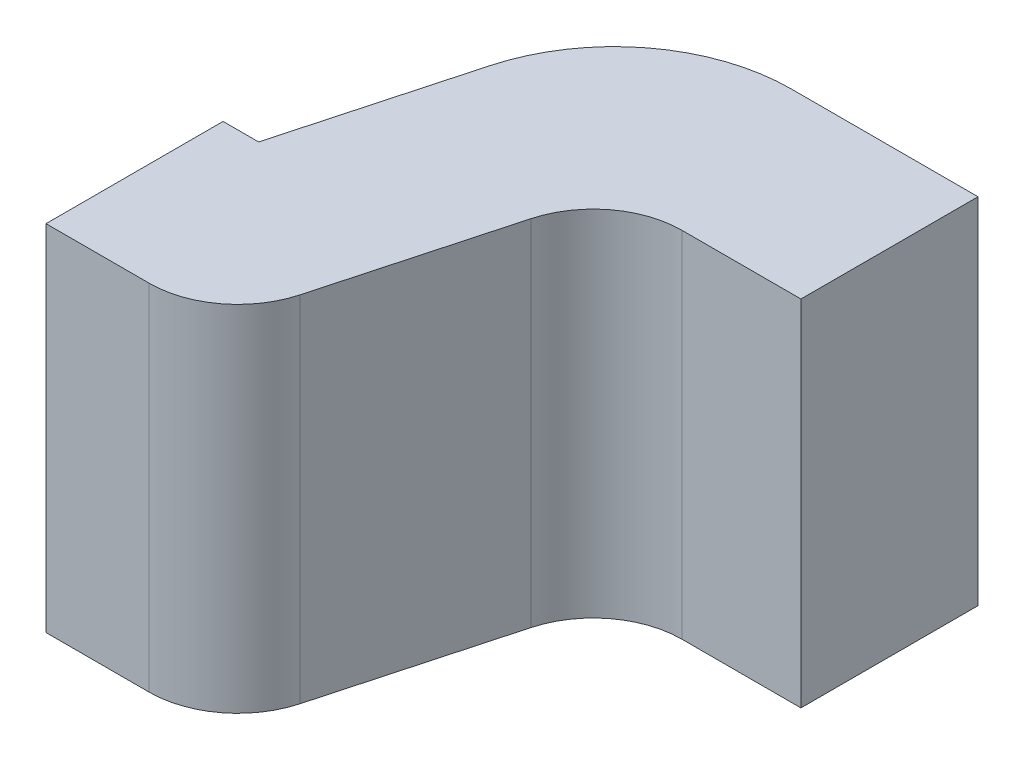
ISO-10303-21;
HEADER;
FILE_DESCRIPTION(('STEP AP214'),'2;1');
FILE_NAME('part.step','',(''),(''),'','','');
FILE_SCHEMA(('AUTOMOTIVE_DESIGN { 1 0 10303 214 1 1 1 1 }'));
ENDSEC;
DATA;
#1=APPLICATION_CONTEXT('core data for automotive mechanical design processes');
#2=APPLICATION_PROTOCOL_DEFINITION('international standard','automotive_design',2000,#1);
#3=PRODUCT_CONTEXT('',#1,'mechanical');
#4=PRODUCT('Part','Part','',(#3));
#5=PRODUCT_RELATED_PRODUCT_CATEGORY('part','',(#4));
#6=PRODUCT_DEFINITION_FORMATION('','',#4);
#7=PRODUCT_DEFINITION_CONTEXT('part definition',#1,'design');
#8=PRODUCT_DEFINITION('design','',#6,#7);
#9=PRODUCT_DEFINITION_SHAPE('','',#8);
#10=(LENGTH_UNIT() NAMED_UNIT(*) SI_UNIT(.MILLI.,.METRE.));
#11=(NAMED_UNIT(*) PLANE_ANGLE_UNIT() SI_UNIT($,.RADIAN.));
#12=(NAMED_UNIT(*) SI_UNIT($,.STERADIAN.) SOLID_ANGLE_UNIT());
#13=UNCERTAINTY_MEASURE_WITH_UNIT(LENGTH_MEASURE(1.E-05),#10,'distance_accuracy_value','');
#14=(GEOMETRIC_REPRESENTATION_CONTEXT(3) GLOBAL_UNCERTAINTY_ASSIGNED_CONTEXT((#13)) GLOBAL_UNIT_ASSIGNED_CONTEXT((#10,
#11,#12)) REPRESENTATION_CONTEXT('',''));
#15=CARTESIAN_POINT('',(0.,0.,0.));
#16=DIRECTION('',(0.,0.,1.));
#17=DIRECTION('',(1.,0.,0.));
#18=AXIS2_PLACEMENT_3D('',#15,#16,#17);
#19=CARTESIAN_POINT('',(0.898916234097,0.22,0.269792734049));
#20=DIRECTION('',(0.,1.,0.));
#21=DIRECTION('',(-1.,0.,0.));
#22=AXIS2_PLACEMENT_3D('',#19,#20,#21);
#23=PLANE('',#22);
#24=DIRECTION('',(1.,0.,0.));
#25=VECTOR('',#24,1.);
#26=CARTESIAN_POINT('',(0.8,0.22,0.22));
#27=LINE('',#26,#25);
#28=CARTESIAN_POINT('',(1.2,0.22,0.22));
#29=VERTEX_POINT('',#28);
#30=CARTESIAN_POINT('',(1.05205262753,0.22,0.22));
#31=VERTEX_POINT('',#30);
#32=EDGE_CURVE('E86',#29,#31,#27,.F.);
#33=ORIENTED_EDGE('',*,*,#32,.F.);
#34=DIRECTION('',(0.,0.,-1.));
#35=VECTOR('',#34,1.);
#36=CARTESIAN_POINT('',(1.2,0.22,0.));
#37=LINE('',#36,#35);
#38=CARTESIAN_POINT('',(1.2,0.22,0.));
#39=VERTEX_POINT('',#38);
#40=EDGE_CURVE('E105',#39,#29,#37,.F.);
#41=ORIENTED_EDGE('',*,*,#40,.F.);
#42=DIRECTION('',(1.,0.,0.));
#43=VECTOR('',#42,1.);
#44=CARTESIAN_POINT('',(0.8,0.22,0.));
#45=LINE('',#44,#43);
#46=CARTESIAN_POINT('',(0.96803508502,0.22,0.));
#47=VERTEX_POINT('',#46);
#48=EDGE_CURVE('E129',#39,#47,#45,.F.);
#49=ORIENTED_EDGE('',*,*,#48,.T.);
#50=CARTESIAN_POINT('',(0.96803508502,0.22,0.22));
#51=DIRECTION('',(0.,1.,0.));
#52=DIRECTION('',(0.,0.,1.));
#53=AXIS2_PLACEMENT_3D('',#50,#51,#52);
#54=CIRCLE('',#53,0.22);
#55=CARTESIAN_POINT('',(0.755787044347605,0.22,0.162114170725821));
#56=VERTEX_POINT('',#55);
#57=EDGE_CURVE('E176',#56,#47,#54,.F.);
#58=ORIENTED_EDGE('',*,*,#57,.F.);
#59=DIRECTION('',(0.26311740579194,0.,-0.964763821237778));
#60=VECTOR('',#59,1.);
#61=CARTESIAN_POINT('',(0.8,0.22,0.));
#62=LINE('',#61,#60);
#63=CARTESIAN_POINT('',(0.694212955652576,0.22,0.387885829274105));
#64=VERTEX_POINT('',#63);
#65=EDGE_CURVE('E135',#56,#64,#62,.F.);
#66=ORIENTED_EDGE('',*,*,#65,.T.);
#67=DIRECTION('',(1.,0.,0.));
#68=VECTOR('',#67,1.);
#69=CARTESIAN_POINT('',(0.65,0.22,0.387885829274));
#70=LINE('',#69,#68);
#71=CARTESIAN_POINT('',(0.65,0.22,0.387885829274));
#72=VERTEX_POINT('',#71);
#73=EDGE_CURVE('E142',#64,#72,#70,.F.);
#74=ORIENTED_EDGE('',*,*,#73,.T.);
#75=DIRECTION('',(0.,0.,-1.));
#76=VECTOR('',#75,1.);
#77=CARTESIAN_POINT('',(0.65,0.22,0.387885829274));
#78=LINE('',#77,#76);
#79=CARTESIAN_POINT('',(0.65,0.22,0.607885829274));
#80=VERTEX_POINT('',#79);
#81=EDGE_CURVE('E148',#72,#80,#78,.F.);
#82=ORIENTED_EDGE('',*,*,#81,.T.);
#83=DIRECTION('',(1.,0.,0.));
#84=VECTOR('',#83,1.);
#85=CARTESIAN_POINT('',(0.65,0.22,0.607885829274));
#86=LINE('',#85,#84);
#87=CARTESIAN_POINT('',(0.778230498162,0.22,0.607885829274));
#88=VERTEX_POINT('',#87);
#89=EDGE_CURVE('E154',#88,#80,#86,.F.);
#90=ORIENTED_EDGE('',*,*,#89,.F.);
#91=CARTESIAN_POINT('',(0.778230498162,0.22,0.497885829274));
#92=DIRECTION('',(0.,1.,0.));
#93=DIRECTION('',(0.,0.,1.));
#94=AXIS2_PLACEMENT_3D('',#91,#92,#93);
#95=CIRCLE('',#94,0.11);
#96=CARTESIAN_POINT('',(0.884354518498314,0.22,0.526828743910985));
#97=VERTEX_POINT('',#96);
#98=EDGE_CURVE('E157',#97,#88,#95,.F.);
#99=ORIENTED_EDGE('',*,*,#98,.F.);
#100=DIRECTION('',(0.26311740579194,0.,-0.964763821237778));
#101=VECTOR('',#100,1.);
#102=CARTESIAN_POINT('',(1.012248040672,0.22,0.05788582927426));
#103=LINE('',#102,#101);
#104=CARTESIAN_POINT('',(0.945928607193356,0.22,0.301057085362789));
#105=VERTEX_POINT('',#104);
#106=EDGE_CURVE('E160',#105,#97,#103,.F.);
#107=ORIENTED_EDGE('',*,*,#106,.F.);
#108=CARTESIAN_POINT('',(1.05205262753,0.22,0.33));
#109=DIRECTION('',(0.,1.,0.));
#110=DIRECTION('',(0.,0.,1.));
#111=AXIS2_PLACEMENT_3D('',#108,#109,#110);
#112=CIRCLE('',#111,0.11);
#113=EDGE_CURVE('E20',#105,#31,#112,.F.);
#114=ORIENTED_EDGE('',*,*,#113,.T.);
#115=EDGE_LOOP('',(#33,#41,#49,#58,#66,#74,#82,#90,#99,#107,#114));
#116=FACE_BOUND('',#115,.T.);
#117=ADVANCED_FACE('F17',(#116),#23,.T.);
#118=CARTESIAN_POINT('',(0.8,-0.22,0.));
#119=DIRECTION('',(0.,0.,1.));
#120=DIRECTION('',(1.,0.,0.));
#121=AXIS2_PLACEMENT_3D('',#118,#119,#120);
#122=PLANE('',#121);
#123=ORIENTED_EDGE('',*,*,#48,.F.);
#124=DIRECTION('',(0.,1.,0.));
#125=VECTOR('',#124,1.);
#126=CARTESIAN_POINT('',(1.2,-0.22,0.));
#127=LINE('',#126,#125);
#128=CARTESIAN_POINT('',(1.2,-0.22,0.));
#129=VERTEX_POINT('',#128);
#130=EDGE_CURVE('E94',#129,#39,#127,.T.);
#131=ORIENTED_EDGE('',*,*,#130,.F.);
#132=DIRECTION('',(1.,0.,0.));
#133=VECTOR('',#132,1.);
#134=CARTESIAN_POINT('',(0.898916234097,-0.22,0.));
#135=LINE('',#134,#133);
#136=CARTESIAN_POINT('',(0.96803508502,-0.22,0.));
#137=VERTEX_POINT('',#136);
#138=EDGE_CURVE('E119',#137,#129,#135,.T.);
#139=ORIENTED_EDGE('',*,*,#138,.F.);
#140=DIRECTION('',(0.,1.,0.));
#141=VECTOR('',#140,1.);
#142=CARTESIAN_POINT('',(0.96803508502,-0.22,0.));
#143=LINE('',#142,#141);
#144=EDGE_CURVE('E121',#47,#137,#143,.F.);
#145=ORIENTED_EDGE('',*,*,#144,.F.);
#146=EDGE_LOOP('',(#123,#131,#139,#145));
#147=FACE_BOUND('',#146,.T.);
#148=ADVANCED_FACE('F254',(#147),#122,.F.);
#149=CARTESIAN_POINT('',(1.2,-0.22,0.));
#150=DIRECTION('',(1.,0.,0.));
#151=DIRECTION('',(0.,0.,-1.));
#152=AXIS2_PLACEMENT_3D('',#149,#150,#151);
#153=PLANE('',#152);
#154=ORIENTED_EDGE('',*,*,#40,.T.);
#155=DIRECTION('',(0.,1.,0.));
#156=VECTOR('',#155,1.);
#157=CARTESIAN_POINT('',(1.2,-0.22,0.22));
#158=LINE('',#157,#156);
#159=CARTESIAN_POINT('',(1.2,-0.22,0.22));
#160=VERTEX_POINT('',#159);
#161=EDGE_CURVE('E99',#160,#29,#158,.T.);
#162=ORIENTED_EDGE('',*,*,#161,.F.);
#163=DIRECTION('',(0.,0.,1.));
#164=VECTOR('',#163,1.);
#165=CARTESIAN_POINT('',(1.2,-0.22,0.269792734049));
#166=LINE('',#165,#164);
#167=EDGE_CURVE('E103',#129,#160,#166,.T.);
#168=ORIENTED_EDGE('',*,*,#167,.F.);
#169=ORIENTED_EDGE('',*,*,#130,.T.);
#170=EDGE_LOOP('',(#154,#162,#168,#169));
#171=FACE_BOUND('',#170,.T.);
#172=ADVANCED_FACE('F101',(#171),#153,.T.);
#173=CARTESIAN_POINT('',(0.8,-0.22,0.22));
#174=DIRECTION('',(0.,0.,1.));
#175=DIRECTION('',(1.,0.,0.));
#176=AXIS2_PLACEMENT_3D('',#173,#174,#175);
#177=PLANE('',#176);
#178=DIRECTION('',(1.,0.,0.));
#179=VECTOR('',#178,1.);
#180=CARTESIAN_POINT('',(0.898916234097,-0.22,0.22));
#181=LINE('',#180,#179);
#182=CARTESIAN_POINT('',(1.05205262753,-0.22,0.22));
#183=VERTEX_POINT('',#182);
#184=EDGE_CURVE('E109',#160,#183,#181,.F.);
#185=ORIENTED_EDGE('',*,*,#184,.F.);
#186=ORIENTED_EDGE('',*,*,#161,.T.);
#187=ORIENTED_EDGE('',*,*,#32,.T.);
#188=DIRECTION('',(0.,1.,0.));
#189=VECTOR('',#188,1.);
#190=CARTESIAN_POINT('',(1.05205262753,-0.22,0.22));
#191=LINE('',#190,#189);
#192=EDGE_CURVE('E111',#31,#183,#191,.F.);
#193=ORIENTED_EDGE('',*,*,#192,.T.);
#194=EDGE_LOOP('',(#185,#186,#187,#193));
#195=FACE_BOUND('',#194,.T.);
#196=ADVANCED_FACE('F110',(#195),#177,.T.);
#197=CARTESIAN_POINT('',(1.05205262753,-0.22,0.33));
#198=DIRECTION('',(0.,1.,0.));
#199=DIRECTION('',(0.,0.,1.));
#200=AXIS2_PLACEMENT_3D('',#197,#198,#199);
#201=CYLINDRICAL_SURFACE('',#200,0.11);
#202=ORIENTED_EDGE('',*,*,#113,.F.);
#203=DIRECTION('',(0.,1.,0.));
#204=VECTOR('',#203,1.);
#205=CARTESIAN_POINT('',(0.945928607193347,-0.22,0.301057085362822));
#206=LINE('',#205,#204);
#207=CARTESIAN_POINT('',(0.945928607193691,-0.22,0.301057085362849));
#208=VERTEX_POINT('',#207);
#209=EDGE_CURVE('E163',#208,#105,#206,.T.);
#210=ORIENTED_EDGE('',*,*,#209,.F.);
#211=CARTESIAN_POINT('',(1.05205262753,-0.22,0.33));
#212=DIRECTION('',(0.,1.,0.));
#213=DIRECTION('',(0.,0.,1.));
#214=AXIS2_PLACEMENT_3D('',#211,#212,#213);
#215=CIRCLE('',#214,0.11);
#216=EDGE_CURVE('E115',#183,#208,#215,.T.);
#217=ORIENTED_EDGE('',*,*,#216,.F.);
#218=ORIENTED_EDGE('',*,*,#192,.F.);
#219=EDGE_LOOP('',(#202,#210,#217,#218));
#220=FACE_BOUND('',#219,.T.);
#221=ADVANCED_FACE('F194',(#220),#201,.F.);
#222=CARTESIAN_POINT('',(1.012248040672,-0.22,0.05788582927426));
#223=DIRECTION('',(0.964763821237778,0.,0.26311740579194));
#224=DIRECTION('',(0.26311740579194,0.,-0.964763821237778));
#225=AXIS2_PLACEMENT_3D('',#222,#223,#224);
#226=PLANE('',#225);
#227=ORIENTED_EDGE('',*,*,#106,.T.);
#228=DIRECTION('',(0.,1.,0.));
#229=VECTOR('',#228,1.);
#230=CARTESIAN_POINT('',(0.884354518498243,-0.22,0.526828743910793));
#231=LINE('',#230,#229);
#232=CARTESIAN_POINT('',(0.88435451849857,-0.22,0.526828743911086));
#233=VERTEX_POINT('',#232);
#234=EDGE_CURVE('E162',#233,#97,#231,.T.);
#235=ORIENTED_EDGE('',*,*,#234,.F.);
#236=DIRECTION('',(-0.26311740579247,0.,0.964763821237634));
#237=VECTOR('',#236,1.);
#238=CARTESIAN_POINT('',(0.945928607194,-0.22,0.301057085363));
#239=LINE('',#238,#237);
#240=EDGE_CURVE('E174',#208,#233,#239,.T.);
#241=ORIENTED_EDGE('',*,*,#240,.F.);
#242=ORIENTED_EDGE('',*,*,#209,.T.);
#243=EDGE_LOOP('',(#227,#235,#241,#242));
#244=FACE_BOUND('',#243,.T.);
#245=ADVANCED_FACE('F192',(#244),#226,.T.);
#246=CARTESIAN_POINT('',(0.778230498162,-0.22,0.497885829274));
#247=DIRECTION('',(0.,1.,0.));
#248=DIRECTION('',(0.,0.,1.));
#249=AXIS2_PLACEMENT_3D('',#246,#247,#248);
#250=CYLINDRICAL_SURFACE('',#249,0.11);
#251=DIRECTION('',(0.,1.,0.));
#252=VECTOR('',#251,1.);
#253=CARTESIAN_POINT('',(0.778230498162,-0.22,0.607885829274));
#254=LINE('',#253,#252);
#255=CARTESIAN_POINT('',(0.778230498162,-0.22,0.607885829274));
#256=VERTEX_POINT('',#255);
#257=EDGE_CURVE('E151',#256,#88,#254,.T.);
#258=ORIENTED_EDGE('',*,*,#257,.F.);
#259=CARTESIAN_POINT('',(0.778230498162,-0.22,0.497885829274));
#260=DIRECTION('',(0.,1.,0.));
#261=DIRECTION('',(0.,0.,1.));
#262=AXIS2_PLACEMENT_3D('',#259,#260,#261);
#263=CIRCLE('',#262,0.11);
#264=EDGE_CURVE('E170',#233,#256,#263,.F.);
#265=ORIENTED_EDGE('',*,*,#264,.F.);
#266=ORIENTED_EDGE('',*,*,#234,.T.);
#267=ORIENTED_EDGE('',*,*,#98,.T.);
#268=EDGE_LOOP('',(#258,#265,#266,#267));
#269=FACE_BOUND('',#268,.T.);
#270=ADVANCED_FACE('F277',(#269),#250,.T.);
#271=CARTESIAN_POINT('',(0.65,-0.22,0.607885829274));
#272=DIRECTION('',(0.,0.,1.));
#273=DIRECTION('',(1.,0.,0.));
#274=AXIS2_PLACEMENT_3D('',#271,#272,#273);
#275=PLANE('',#274);
#276=DIRECTION('',(1.,0.,0.));
#277=VECTOR('',#276,1.);
#278=CARTESIAN_POINT('',(0.898916234097,-0.22,0.607885829274));
#279=LINE('',#278,#277);
#280=CARTESIAN_POINT('',(0.65,-0.22,0.607885829274));
#281=VERTEX_POINT('',#280);
#282=EDGE_CURVE('E173',#256,#281,#279,.F.);
#283=ORIENTED_EDGE('',*,*,#282,.F.);
#284=ORIENTED_EDGE('',*,*,#257,.T.);
#285=ORIENTED_EDGE('',*,*,#89,.T.);
#286=DIRECTION('',(0.,1.,0.));
#287=VECTOR('',#286,1.);
#288=CARTESIAN_POINT('',(0.65,-0.22,0.607885829274));
#289=LINE('',#288,#287);
#290=EDGE_CURVE('E145',#80,#281,#289,.F.);
#291=ORIENTED_EDGE('',*,*,#290,.T.);
#292=EDGE_LOOP('',(#283,#284,#285,#291));
#293=FACE_BOUND('',#292,.T.);
#294=ADVANCED_FACE('F231',(#293),#275,.T.);
#295=CARTESIAN_POINT('',(0.65,-0.22,0.387885829274));
#296=DIRECTION('',(1.,0.,0.));
#297=DIRECTION('',(0.,0.,-1.));
#298=AXIS2_PLACEMENT_3D('',#295,#296,#297);
#299=PLANE('',#298);
#300=ORIENTED_EDGE('',*,*,#290,.F.);
#301=ORIENTED_EDGE('',*,*,#81,.F.);
#302=DIRECTION('',(0.,1.,0.));
#303=VECTOR('',#302,1.);
#304=CARTESIAN_POINT('',(0.65,-0.22,0.387885829274));
#305=LINE('',#304,#303);
#306=CARTESIAN_POINT('',(0.65,-0.22,0.387885829274));
#307=VERTEX_POINT('',#306);
#308=EDGE_CURVE('E139',#72,#307,#305,.F.);
#309=ORIENTED_EDGE('',*,*,#308,.T.);
#310=DIRECTION('',(0.,0.,1.));
#311=VECTOR('',#310,1.);
#312=CARTESIAN_POINT('',(0.65,-0.22,0.269792734049));
#313=LINE('',#312,#311);
#314=EDGE_CURVE('E214',#281,#307,#313,.F.);
#315=ORIENTED_EDGE('',*,*,#314,.F.);
#316=EDGE_LOOP('',(#300,#301,#309,#315));
#317=FACE_BOUND('',#316,.T.);
#318=ADVANCED_FACE('F235',(#317),#299,.F.);
#319=CARTESIAN_POINT('',(0.65,-0.22,0.387885829274));
#320=DIRECTION('',(0.,0.,1.));
#321=DIRECTION('',(1.,0.,0.));
#322=AXIS2_PLACEMENT_3D('',#319,#320,#321);
#323=PLANE('',#322);
#324=DIRECTION('',(1.,0.,0.));
#325=VECTOR('',#324,1.);
#326=CARTESIAN_POINT('',(0.898916234097,-0.22,0.387885829274));
#327=LINE('',#326,#325);
#328=CARTESIAN_POINT('',(0.694212955652192,-0.22,0.387885829274052));
#329=VERTEX_POINT('',#328);
#330=EDGE_CURVE('E211',#307,#329,#327,.T.);
#331=ORIENTED_EDGE('',*,*,#330,.F.);
#332=ORIENTED_EDGE('',*,*,#308,.F.);
#333=ORIENTED_EDGE('',*,*,#73,.F.);
#334=DIRECTION('',(0.,1.,0.));
#335=VECTOR('',#334,1.);
#336=CARTESIAN_POINT('',(0.694212955652576,-0.22,0.387885829274157));
#337=LINE('',#336,#335);
#338=EDGE_CURVE('E138',#64,#329,#337,.F.);
#339=ORIENTED_EDGE('',*,*,#338,.T.);
#340=EDGE_LOOP('',(#331,#332,#333,#339));
#341=FACE_BOUND('',#340,.T.);
#342=ADVANCED_FACE('F248',(#341),#323,.F.);
#343=CARTESIAN_POINT('',(0.8,-0.22,0.));
#344=DIRECTION('',(0.964763821237778,0.,0.26311740579194));
#345=DIRECTION('',(0.26311740579194,0.,-0.964763821237778));
#346=AXIS2_PLACEMENT_3D('',#343,#344,#345);
#347=PLANE('',#346);
#348=ORIENTED_EDGE('',*,*,#65,.F.);
#349=DIRECTION('',(0.,1.,0.));
#350=VECTOR('',#349,1.);
#351=CARTESIAN_POINT('',(0.755787044347653,-0.22,0.162114170725905));
#352=LINE('',#351,#350);
#353=CARTESIAN_POINT('',(0.75578704434798,-0.22,0.162114170725391));
#354=VERTEX_POINT('',#353);
#355=EDGE_CURVE('E35',#354,#56,#352,.T.);
#356=ORIENTED_EDGE('',*,*,#355,.F.);
#357=DIRECTION('',(0.263117405796448,0.,-0.964763821236549));
#358=VECTOR('',#357,1.);
#359=CARTESIAN_POINT('',(0.694212955652,-0.22,0.387885829274));
#360=LINE('',#359,#358);
#361=EDGE_CURVE('E26',#329,#354,#360,.T.);
#362=ORIENTED_EDGE('',*,*,#361,.F.);
#363=ORIENTED_EDGE('',*,*,#338,.F.);
#364=EDGE_LOOP('',(#348,#356,#362,#363));
#365=FACE_BOUND('',#364,.T.);
#366=ADVANCED_FACE('F242',(#365),#347,.F.);
#367=CARTESIAN_POINT('',(0.96803508502,-0.22,0.22));
#368=DIRECTION('',(0.,1.,0.));
#369=DIRECTION('',(0.,0.,1.));
#370=AXIS2_PLACEMENT_3D('',#367,#368,#369);
#371=CYLINDRICAL_SURFACE('',#370,0.22);
#372=ORIENTED_EDGE('',*,*,#57,.T.);
#373=ORIENTED_EDGE('',*,*,#144,.T.);
#374=CARTESIAN_POINT('',(0.96803508502,-0.22,0.22));
#375=DIRECTION('',(0.,1.,0.));
#376=DIRECTION('',(0.,0.,1.));
#377=AXIS2_PLACEMENT_3D('',#374,#375,#376);
#378=CIRCLE('',#377,0.22);
#379=EDGE_CURVE('E11',#354,#137,#378,.F.);
#380=ORIENTED_EDGE('',*,*,#379,.F.);
#381=ORIENTED_EDGE('',*,*,#355,.T.);
#382=EDGE_LOOP('',(#372,#373,#380,#381));
#383=FACE_BOUND('',#382,.T.);
#384=ADVANCED_FACE('F253',(#383),#371,.T.);
#385=CARTESIAN_POINT('',(0.898916234097,-0.22,0.269792734049));
#386=DIRECTION('',(0.,-1.,0.));
#387=DIRECTION('',(1.,0.,0.));
#388=AXIS2_PLACEMENT_3D('',#385,#386,#387);
#389=PLANE('',#388);
#390=ORIENTED_EDGE('',*,*,#361,.T.);
#391=ORIENTED_EDGE('',*,*,#379,.T.);
#392=ORIENTED_EDGE('',*,*,#138,.T.);
#393=ORIENTED_EDGE('',*,*,#167,.T.);
#394=ORIENTED_EDGE('',*,*,#184,.T.);
#395=ORIENTED_EDGE('',*,*,#216,.T.);
#396=ORIENTED_EDGE('',*,*,#240,.T.);
#397=ORIENTED_EDGE('',*,*,#264,.T.);
#398=ORIENTED_EDGE('',*,*,#282,.T.);
#399=ORIENTED_EDGE('',*,*,#314,.T.);
#400=ORIENTED_EDGE('',*,*,#330,.T.);
#401=EDGE_LOOP('',(#390,#391,#392,#393,#394,#395,#396,#397,#398,#399,#400));
#402=FACE_BOUND('',#401,.T.);
#403=ADVANCED_FACE('F118',(#402),#389,.T.);
#404=CLOSED_SHELL('',(#117,#148,#172,#196,#221,#245,#270,#294,#318,#342,#366,#384,#403));
#405=MANIFOLD_SOLID_BREP('B1',#404);
#406=ADVANCED_BREP_SHAPE_REPRESENTATION('',(#18,#405),#14);
#407=SHAPE_DEFINITION_REPRESENTATION(#9,#406);
ENDSEC;
END-ISO-10303-21;
